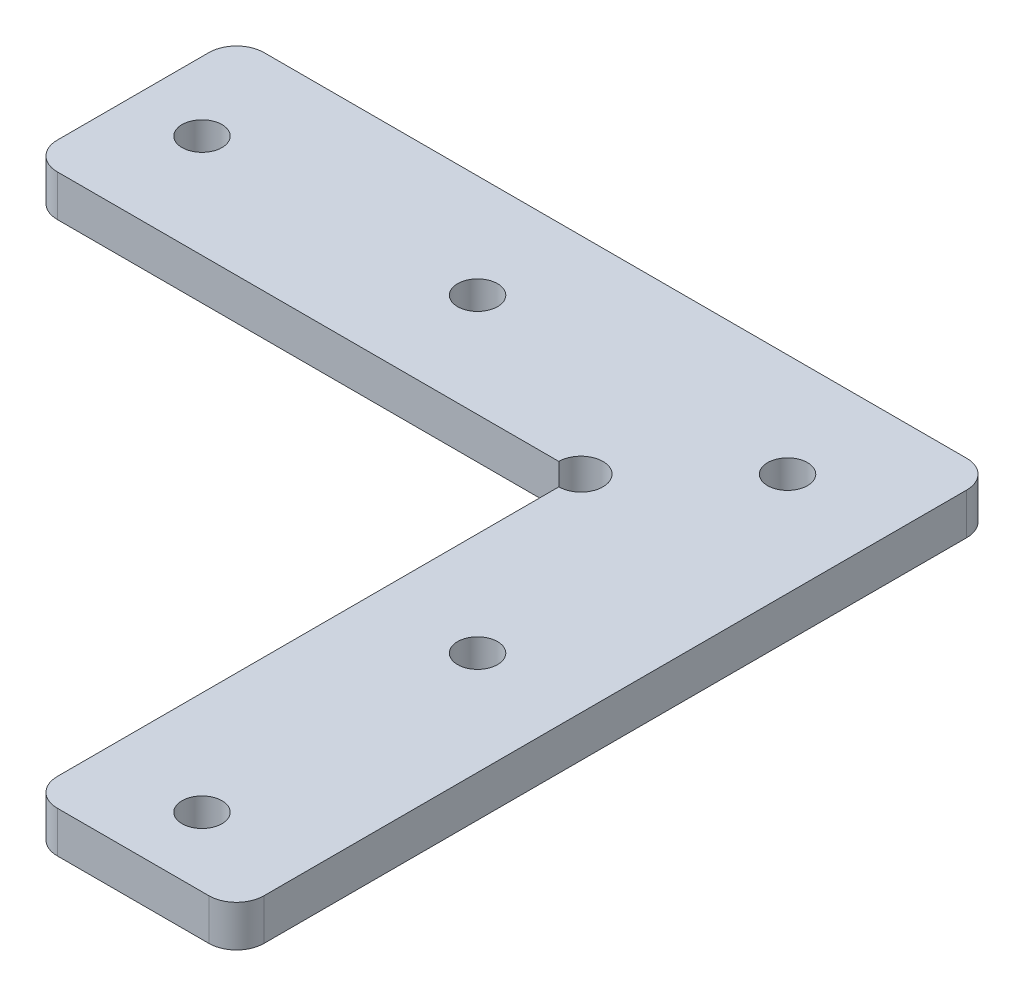
ISO-10303-21;
HEADER;
FILE_DESCRIPTION(('STEP AP214'),'2;1');
FILE_NAME('part.step','',(''),(''),'','','');
FILE_SCHEMA(('AUTOMOTIVE_DESIGN { 1 0 10303 214 1 1 1 1 }'));
ENDSEC;
DATA;
#1=APPLICATION_CONTEXT('core data for automotive mechanical design processes');
#2=APPLICATION_PROTOCOL_DEFINITION('international standard','automotive_design',2000,#1);
#3=PRODUCT_CONTEXT('',#1,'mechanical');
#4=PRODUCT('Part','Part','',(#3));
#5=PRODUCT_RELATED_PRODUCT_CATEGORY('part','',(#4));
#6=PRODUCT_DEFINITION_FORMATION('','',#4);
#7=PRODUCT_DEFINITION_CONTEXT('part definition',#1,'design');
#8=PRODUCT_DEFINITION('design','',#6,#7);
#9=PRODUCT_DEFINITION_SHAPE('','',#8);
#10=(LENGTH_UNIT() NAMED_UNIT(*) SI_UNIT(.MILLI.,.METRE.));
#11=(NAMED_UNIT(*) PLANE_ANGLE_UNIT() SI_UNIT($,.RADIAN.));
#12=(NAMED_UNIT(*) SI_UNIT($,.STERADIAN.) SOLID_ANGLE_UNIT());
#13=UNCERTAINTY_MEASURE_WITH_UNIT(LENGTH_MEASURE(1.E-05),#10,'distance_accuracy_value','');
#14=(GEOMETRIC_REPRESENTATION_CONTEXT(3) GLOBAL_UNCERTAINTY_ASSIGNED_CONTEXT((#13)) GLOBAL_UNIT_ASSIGNED_CONTEXT((#10,
#11,#12)) REPRESENTATION_CONTEXT('',''));
#15=CARTESIAN_POINT('',(0.,0.,0.));
#16=DIRECTION('',(0.,0.,1.));
#17=DIRECTION('',(1.,0.,0.));
#18=AXIS2_PLACEMENT_3D('',#15,#16,#17);
#19=CARTESIAN_POINT('',(0.,3.,0.));
#20=DIRECTION('',(0.,-1.,0.));
#21=DIRECTION('',(0.,0.,-1.));
#22=AXIS2_PLACEMENT_3D('',#19,#20,#21);
#23=PLANE('',#22);
#24=DIRECTION('',(1.,0.,0.));
#25=VECTOR('',#24,1.);
#26=CARTESIAN_POINT('',(-15.,3.,15.));
#27=LINE('',#26,#25);
#28=CARTESIAN_POINT('',(-53.,3.,15.));
#29=VERTEX_POINT('',#28);
#30=CARTESIAN_POINT('',(-16.6,3.,15.));
#31=VERTEX_POINT('',#30);
#32=EDGE_CURVE('E141',#29,#31,#27,.T.);
#33=ORIENTED_EDGE('',*,*,#32,.T.);
#34=CARTESIAN_POINT('',(-15.,3.,15.));
#35=DIRECTION('',(0.,1.,0.));
#36=DIRECTION('',(0.,0.,1.));
#37=AXIS2_PLACEMENT_3D('',#34,#35,#36);
#38=CIRCLE('',#37,1.6);
#39=CARTESIAN_POINT('',(-15.,3.,16.6));
#40=VERTEX_POINT('',#39);
#41=EDGE_CURVE('E130',#40,#31,#38,.T.);
#42=ORIENTED_EDGE('',*,*,#41,.F.);
#43=DIRECTION('',(0.,0.,1.));
#44=VECTOR('',#43,1.);
#45=CARTESIAN_POINT('',(-15.,3.,55.));
#46=LINE('',#45,#44);
#47=CARTESIAN_POINT('',(-15.,3.,53.));
#48=VERTEX_POINT('',#47);
#49=EDGE_CURVE('E138',#40,#48,#46,.T.);
#50=ORIENTED_EDGE('',*,*,#49,.T.);
#51=CARTESIAN_POINT('',(-13.,3.,53.));
#52=DIRECTION('',(0.,-1.,0.));
#53=DIRECTION('',(0.,0.,-1.));
#54=AXIS2_PLACEMENT_3D('',#51,#52,#53);
#55=CIRCLE('',#54,2.);
#56=CARTESIAN_POINT('',(-13.,3.,55.));
#57=VERTEX_POINT('',#56);
#58=EDGE_CURVE('E202',#48,#57,#55,.F.);
#59=ORIENTED_EDGE('',*,*,#58,.T.);
#60=DIRECTION('',(1.,0.,0.));
#61=VECTOR('',#60,1.);
#62=CARTESIAN_POINT('',(0.,3.,55.));
#63=LINE('',#62,#61);
#64=CARTESIAN_POINT('',(-2.,3.,55.));
#65=VERTEX_POINT('',#64);
#66=EDGE_CURVE('E147',#57,#65,#63,.T.);
#67=ORIENTED_EDGE('',*,*,#66,.T.);
#68=CARTESIAN_POINT('',(-2.,3.,53.));
#69=DIRECTION('',(0.,-1.,0.));
#70=DIRECTION('',(0.,0.,-1.));
#71=AXIS2_PLACEMENT_3D('',#68,#69,#70);
#72=CIRCLE('',#71,2.);
#73=CARTESIAN_POINT('',(0.,3.,53.));
#74=VERTEX_POINT('',#73);
#75=EDGE_CURVE('E200',#65,#74,#72,.F.);
#76=ORIENTED_EDGE('',*,*,#75,.T.);
#77=DIRECTION('',(0.,0.,-1.));
#78=VECTOR('',#77,1.);
#79=CARTESIAN_POINT('',(0.,3.,0.));
#80=LINE('',#79,#78);
#81=CARTESIAN_POINT('',(0.,3.,2.));
#82=VERTEX_POINT('',#81);
#83=EDGE_CURVE('E150',#74,#82,#80,.T.);
#84=ORIENTED_EDGE('',*,*,#83,.T.);
#85=CARTESIAN_POINT('',(-2.,3.,2.));
#86=DIRECTION('',(0.,-1.,0.));
#87=DIRECTION('',(0.,0.,-1.));
#88=AXIS2_PLACEMENT_3D('',#85,#86,#87);
#89=CIRCLE('',#88,2.);
#90=CARTESIAN_POINT('',(-2.,3.,0.));
#91=VERTEX_POINT('',#90);
#92=EDGE_CURVE('E198',#82,#91,#89,.F.);
#93=ORIENTED_EDGE('',*,*,#92,.T.);
#94=DIRECTION('',(-1.,0.,0.));
#95=VECTOR('',#94,1.);
#96=CARTESIAN_POINT('',(-55.,3.,0.));
#97=LINE('',#96,#95);
#98=CARTESIAN_POINT('',(-53.,3.,0.));
#99=VERTEX_POINT('',#98);
#100=EDGE_CURVE('E157',#91,#99,#97,.T.);
#101=ORIENTED_EDGE('',*,*,#100,.T.);
#102=CARTESIAN_POINT('',(-53.,3.,2.));
#103=DIRECTION('',(0.,-1.,0.));
#104=DIRECTION('',(0.,0.,-1.));
#105=AXIS2_PLACEMENT_3D('',#102,#103,#104);
#106=CIRCLE('',#105,2.);
#107=CARTESIAN_POINT('',(-55.,3.,2.));
#108=VERTEX_POINT('',#107);
#109=EDGE_CURVE('E206',#99,#108,#106,.F.);
#110=ORIENTED_EDGE('',*,*,#109,.T.);
#111=DIRECTION('',(0.,0.,1.));
#112=VECTOR('',#111,1.);
#113=CARTESIAN_POINT('',(-55.,3.,15.));
#114=LINE('',#113,#112);
#115=CARTESIAN_POINT('',(-55.,3.,13.));
#116=VERTEX_POINT('',#115);
#117=EDGE_CURVE('E152',#108,#116,#114,.T.);
#118=ORIENTED_EDGE('',*,*,#117,.T.);
#119=CARTESIAN_POINT('',(-53.,3.,13.));
#120=DIRECTION('',(0.,-1.,0.));
#121=DIRECTION('',(0.,0.,-1.));
#122=AXIS2_PLACEMENT_3D('',#119,#120,#121);
#123=CIRCLE('',#122,2.);
#124=EDGE_CURVE('E204',#116,#29,#123,.F.);
#125=ORIENTED_EDGE('',*,*,#124,.T.);
#126=EDGE_LOOP('',(#33,#42,#50,#59,#67,#76,#84,#93,#101,#110,#118,#125));
#127=FACE_BOUND('',#126,.T.);
#128=CARTESIAN_POINT('',(-7.5,3.,7.5));
#129=DIRECTION('',(0.,1.,0.));
#130=DIRECTION('',(0.,0.,1.));
#131=AXIS2_PLACEMENT_3D('',#128,#129,#130);
#132=CIRCLE('',#131,1.45);
#133=CARTESIAN_POINT('',(-7.5,3.,8.95));
#134=VERTEX_POINT('',#133);
#135=EDGE_CURVE('E165',#134,#134,#132,.T.);
#136=ORIENTED_EDGE('',*,*,#135,.F.);
#137=EDGE_LOOP('',(#136));
#138=FACE_BOUND('',#137,.T.);
#139=CARTESIAN_POINT('',(-7.49999999999999,3.,30.));
#140=DIRECTION('',(0.,1.,0.));
#141=DIRECTION('',(0.,0.,1.));
#142=AXIS2_PLACEMENT_3D('',#139,#140,#141);
#143=CIRCLE('',#142,1.45);
#144=CARTESIAN_POINT('',(-7.49999999999999,3.,31.45));
#145=VERTEX_POINT('',#144);
#146=EDGE_CURVE('E275',#145,#145,#143,.T.);
#147=ORIENTED_EDGE('',*,*,#146,.F.);
#148=EDGE_LOOP('',(#147));
#149=FACE_BOUND('',#148,.T.);
#150=CARTESIAN_POINT('',(-7.49999999999999,3.,50.));
#151=DIRECTION('',(0.,1.,0.));
#152=DIRECTION('',(0.,0.,1.));
#153=AXIS2_PLACEMENT_3D('',#150,#151,#152);
#154=CIRCLE('',#153,1.45);
#155=CARTESIAN_POINT('',(-7.49999999999999,3.,51.45));
#156=VERTEX_POINT('',#155);
#157=EDGE_CURVE('E269',#156,#156,#154,.T.);
#158=ORIENTED_EDGE('',*,*,#157,.F.);
#159=EDGE_LOOP('',(#158));
#160=FACE_BOUND('',#159,.T.);
#161=CARTESIAN_POINT('',(-30.,3.,7.5));
#162=DIRECTION('',(0.,1.,0.));
#163=DIRECTION('',(0.,0.,1.));
#164=AXIS2_PLACEMENT_3D('',#161,#162,#163);
#165=CIRCLE('',#164,1.45);
#166=CARTESIAN_POINT('',(-30.,3.,8.95));
#167=VERTEX_POINT('',#166);
#168=EDGE_CURVE('E263',#167,#167,#165,.T.);
#169=ORIENTED_EDGE('',*,*,#168,.F.);
#170=EDGE_LOOP('',(#169));
#171=FACE_BOUND('',#170,.T.);
#172=CARTESIAN_POINT('',(-50.,3.,7.5));
#173=DIRECTION('',(0.,1.,0.));
#174=DIRECTION('',(0.,0.,1.));
#175=AXIS2_PLACEMENT_3D('',#172,#173,#174);
#176=CIRCLE('',#175,1.45);
#177=CARTESIAN_POINT('',(-50.,3.,8.95));
#178=VERTEX_POINT('',#177);
#179=EDGE_CURVE('E256',#178,#178,#176,.T.);
#180=ORIENTED_EDGE('',*,*,#179,.F.);
#181=EDGE_LOOP('',(#180));
#182=FACE_BOUND('',#181,.T.);
#183=ADVANCED_FACE('F41',(#127,#138,#149,#160,#171,#182),#23,.F.);
#184=CARTESIAN_POINT('',(0.,0.,0.));
#185=DIRECTION('',(0.,-1.,0.));
#186=DIRECTION('',(0.,0.,-1.));
#187=AXIS2_PLACEMENT_3D('',#184,#185,#186);
#188=PLANE('',#187);
#189=CARTESIAN_POINT('',(-15.,0.,15.));
#190=DIRECTION('',(0.,1.,0.));
#191=DIRECTION('',(0.,0.,1.));
#192=AXIS2_PLACEMENT_3D('',#189,#190,#191);
#193=CIRCLE('',#192,1.6);
#194=CARTESIAN_POINT('',(-15.,0.,16.6));
#195=VERTEX_POINT('',#194);
#196=CARTESIAN_POINT('',(-16.6,0.,15.));
#197=VERTEX_POINT('',#196);
#198=EDGE_CURVE('E56',#195,#197,#193,.T.);
#199=ORIENTED_EDGE('',*,*,#198,.T.);
#200=DIRECTION('',(1.,0.,0.));
#201=VECTOR('',#200,1.);
#202=CARTESIAN_POINT('',(-15.,0.,15.));
#203=LINE('',#202,#201);
#204=CARTESIAN_POINT('',(-53.,0.,15.));
#205=VERTEX_POINT('',#204);
#206=EDGE_CURVE('E164',#205,#197,#203,.T.);
#207=ORIENTED_EDGE('',*,*,#206,.F.);
#208=CARTESIAN_POINT('',(-53.,0.,13.));
#209=DIRECTION('',(0.,-1.,0.));
#210=DIRECTION('',(0.,0.,-1.));
#211=AXIS2_PLACEMENT_3D('',#208,#209,#210);
#212=CIRCLE('',#211,2.);
#213=CARTESIAN_POINT('',(-55.,0.,13.));
#214=VERTEX_POINT('',#213);
#215=EDGE_CURVE('E189',#205,#214,#212,.T.);
#216=ORIENTED_EDGE('',*,*,#215,.T.);
#217=DIRECTION('',(0.,0.,1.));
#218=VECTOR('',#217,1.);
#219=CARTESIAN_POINT('',(-55.,0.,15.));
#220=LINE('',#219,#218);
#221=CARTESIAN_POINT('',(-55.,0.,2.));
#222=VERTEX_POINT('',#221);
#223=EDGE_CURVE('E161',#222,#214,#220,.T.);
#224=ORIENTED_EDGE('',*,*,#223,.F.);
#225=CARTESIAN_POINT('',(-53.,0.,2.));
#226=DIRECTION('',(0.,-1.,0.));
#227=DIRECTION('',(0.,0.,-1.));
#228=AXIS2_PLACEMENT_3D('',#225,#226,#227);
#229=CIRCLE('',#228,2.);
#230=CARTESIAN_POINT('',(-53.,0.,0.));
#231=VERTEX_POINT('',#230);
#232=EDGE_CURVE('E191',#222,#231,#229,.T.);
#233=ORIENTED_EDGE('',*,*,#232,.T.);
#234=DIRECTION('',(-1.,0.,0.));
#235=VECTOR('',#234,1.);
#236=CARTESIAN_POINT('',(-55.,0.,0.));
#237=LINE('',#236,#235);
#238=CARTESIAN_POINT('',(-2.,0.,0.));
#239=VERTEX_POINT('',#238);
#240=EDGE_CURVE('E175',#239,#231,#237,.T.);
#241=ORIENTED_EDGE('',*,*,#240,.F.);
#242=CARTESIAN_POINT('',(-2.,0.,2.));
#243=DIRECTION('',(0.,-1.,0.));
#244=DIRECTION('',(0.,0.,-1.));
#245=AXIS2_PLACEMENT_3D('',#242,#243,#244);
#246=CIRCLE('',#245,2.);
#247=CARTESIAN_POINT('',(0.,0.,2.));
#248=VERTEX_POINT('',#247);
#249=EDGE_CURVE('E182',#239,#248,#246,.T.);
#250=ORIENTED_EDGE('',*,*,#249,.T.);
#251=DIRECTION('',(0.,0.,-1.));
#252=VECTOR('',#251,1.);
#253=CARTESIAN_POINT('',(0.,0.,0.));
#254=LINE('',#253,#252);
#255=CARTESIAN_POINT('',(0.,0.,53.));
#256=VERTEX_POINT('',#255);
#257=EDGE_CURVE('E173',#256,#248,#254,.T.);
#258=ORIENTED_EDGE('',*,*,#257,.F.);
#259=CARTESIAN_POINT('',(-2.,0.,53.));
#260=DIRECTION('',(0.,-1.,0.));
#261=DIRECTION('',(0.,0.,-1.));
#262=AXIS2_PLACEMENT_3D('',#259,#260,#261);
#263=CIRCLE('',#262,2.);
#264=CARTESIAN_POINT('',(-2.,0.,55.));
#265=VERTEX_POINT('',#264);
#266=EDGE_CURVE('E184',#256,#265,#263,.T.);
#267=ORIENTED_EDGE('',*,*,#266,.T.);
#268=DIRECTION('',(1.,0.,0.));
#269=VECTOR('',#268,1.);
#270=CARTESIAN_POINT('',(0.,0.,55.));
#271=LINE('',#270,#269);
#272=CARTESIAN_POINT('',(-13.,0.,55.));
#273=VERTEX_POINT('',#272);
#274=EDGE_CURVE('E170',#273,#265,#271,.T.);
#275=ORIENTED_EDGE('',*,*,#274,.F.);
#276=CARTESIAN_POINT('',(-13.,0.,53.));
#277=DIRECTION('',(0.,-1.,0.));
#278=DIRECTION('',(0.,0.,-1.));
#279=AXIS2_PLACEMENT_3D('',#276,#277,#278);
#280=CIRCLE('',#279,2.);
#281=CARTESIAN_POINT('',(-15.,0.,53.));
#282=VERTEX_POINT('',#281);
#283=EDGE_CURVE('E186',#273,#282,#280,.T.);
#284=ORIENTED_EDGE('',*,*,#283,.T.);
#285=DIRECTION('',(0.,0.,1.));
#286=VECTOR('',#285,1.);
#287=CARTESIAN_POINT('',(-15.,0.,55.));
#288=LINE('',#287,#286);
#289=EDGE_CURVE('E168',#195,#282,#288,.T.);
#290=ORIENTED_EDGE('',*,*,#289,.F.);
#291=EDGE_LOOP('',(#199,#207,#216,#224,#233,#241,#250,#258,#267,#275,#284,#290));
#292=FACE_BOUND('',#291,.T.);
#293=CARTESIAN_POINT('',(-30.,0.,7.5));
#294=DIRECTION('',(0.,1.,0.));
#295=DIRECTION('',(0.,0.,1.));
#296=AXIS2_PLACEMENT_3D('',#293,#294,#295);
#297=CIRCLE('',#296,1.45);
#298=CARTESIAN_POINT('',(-30.,0.,8.95));
#299=VERTEX_POINT('',#298);
#300=EDGE_CURVE('E261',#299,#299,#297,.T.);
#301=ORIENTED_EDGE('',*,*,#300,.T.);
#302=EDGE_LOOP('',(#301));
#303=FACE_BOUND('',#302,.T.);
#304=CARTESIAN_POINT('',(-7.49999999999999,0.,30.));
#305=DIRECTION('',(0.,1.,0.));
#306=DIRECTION('',(0.,0.,1.));
#307=AXIS2_PLACEMENT_3D('',#304,#305,#306);
#308=CIRCLE('',#307,1.45);
#309=CARTESIAN_POINT('',(-7.49999999999999,0.,31.45));
#310=VERTEX_POINT('',#309);
#311=EDGE_CURVE('E272',#310,#310,#308,.T.);
#312=ORIENTED_EDGE('',*,*,#311,.T.);
#313=EDGE_LOOP('',(#312));
#314=FACE_BOUND('',#313,.T.);
#315=CARTESIAN_POINT('',(-7.5,0.,7.5));
#316=DIRECTION('',(0.,1.,0.));
#317=DIRECTION('',(0.,0.,1.));
#318=AXIS2_PLACEMENT_3D('',#315,#316,#317);
#319=CIRCLE('',#318,1.45);
#320=CARTESIAN_POINT('',(-7.5,0.,8.95));
#321=VERTEX_POINT('',#320);
#322=EDGE_CURVE('E278',#321,#321,#319,.T.);
#323=ORIENTED_EDGE('',*,*,#322,.T.);
#324=EDGE_LOOP('',(#323));
#325=FACE_BOUND('',#324,.T.);
#326=CARTESIAN_POINT('',(-7.49999999999999,0.,50.));
#327=DIRECTION('',(0.,1.,0.));
#328=DIRECTION('',(0.,0.,1.));
#329=AXIS2_PLACEMENT_3D('',#326,#327,#328);
#330=CIRCLE('',#329,1.45);
#331=CARTESIAN_POINT('',(-7.49999999999999,0.,51.45));
#332=VERTEX_POINT('',#331);
#333=EDGE_CURVE('E266',#332,#332,#330,.T.);
#334=ORIENTED_EDGE('',*,*,#333,.T.);
#335=EDGE_LOOP('',(#334));
#336=FACE_BOUND('',#335,.T.);
#337=CARTESIAN_POINT('',(-50.,0.,7.5));
#338=DIRECTION('',(0.,1.,0.));
#339=DIRECTION('',(0.,0.,1.));
#340=AXIS2_PLACEMENT_3D('',#337,#338,#339);
#341=CIRCLE('',#340,1.45);
#342=CARTESIAN_POINT('',(-50.,0.,8.95));
#343=VERTEX_POINT('',#342);
#344=EDGE_CURVE('E253',#343,#343,#341,.T.);
#345=ORIENTED_EDGE('',*,*,#344,.T.);
#346=EDGE_LOOP('',(#345));
#347=FACE_BOUND('',#346,.T.);
#348=ADVANCED_FACE('F224',(#292,#303,#314,#325,#336,#347),#188,.T.);
#349=CARTESIAN_POINT('',(-55.,3.,15.));
#350=DIRECTION('',(1.,0.,0.));
#351=DIRECTION('',(0.,0.,-1.));
#352=AXIS2_PLACEMENT_3D('',#349,#350,#351);
#353=PLANE('',#352);
#354=ORIENTED_EDGE('',*,*,#117,.F.);
#355=DIRECTION('',(0.,-1.,0.));
#356=VECTOR('',#355,1.);
#357=CARTESIAN_POINT('',(-55.,3.,2.));
#358=LINE('',#357,#356);
#359=EDGE_CURVE('E179',#108,#222,#358,.T.);
#360=ORIENTED_EDGE('',*,*,#359,.T.);
#361=ORIENTED_EDGE('',*,*,#223,.T.);
#362=DIRECTION('',(0.,-1.,0.));
#363=VECTOR('',#362,1.);
#364=CARTESIAN_POINT('',(-55.,3.,13.));
#365=LINE('',#364,#363);
#366=EDGE_CURVE('E160',#214,#116,#365,.F.);
#367=ORIENTED_EDGE('',*,*,#366,.T.);
#368=EDGE_LOOP('',(#354,#360,#361,#367));
#369=FACE_BOUND('',#368,.T.);
#370=ADVANCED_FACE('F243',(#369),#353,.F.);
#371=CARTESIAN_POINT('',(-15.,3.,15.));
#372=DIRECTION('',(0.,0.,-1.));
#373=DIRECTION('',(-1.,0.,0.));
#374=AXIS2_PLACEMENT_3D('',#371,#372,#373);
#375=PLANE('',#374);
#376=ORIENTED_EDGE('',*,*,#206,.T.);
#377=DIRECTION('',(0.,1.,0.));
#378=VECTOR('',#377,1.);
#379=CARTESIAN_POINT('',(-16.6,0.,15.));
#380=LINE('',#379,#378);
#381=EDGE_CURVE('E252',#197,#31,#380,.T.);
#382=ORIENTED_EDGE('',*,*,#381,.T.);
#383=ORIENTED_EDGE('',*,*,#32,.F.);
#384=DIRECTION('',(0.,-1.,0.));
#385=VECTOR('',#384,1.);
#386=CARTESIAN_POINT('',(-53.,3.,15.));
#387=LINE('',#386,#385);
#388=EDGE_CURVE('E208',#29,#205,#387,.T.);
#389=ORIENTED_EDGE('',*,*,#388,.T.);
#390=EDGE_LOOP('',(#376,#382,#383,#389));
#391=FACE_BOUND('',#390,.T.);
#392=ADVANCED_FACE('F251',(#391),#375,.F.);
#393=CARTESIAN_POINT('',(-15.,3.,55.));
#394=DIRECTION('',(1.,0.,0.));
#395=DIRECTION('',(0.,0.,-1.));
#396=AXIS2_PLACEMENT_3D('',#393,#394,#395);
#397=PLANE('',#396);
#398=ORIENTED_EDGE('',*,*,#49,.F.);
#399=DIRECTION('',(0.,1.,0.));
#400=VECTOR('',#399,1.);
#401=CARTESIAN_POINT('',(-15.,0.,16.6));
#402=LINE('',#401,#400);
#403=EDGE_CURVE('E11',#40,#195,#402,.F.);
#404=ORIENTED_EDGE('',*,*,#403,.T.);
#405=ORIENTED_EDGE('',*,*,#289,.T.);
#406=DIRECTION('',(0.,-1.,0.));
#407=VECTOR('',#406,1.);
#408=CARTESIAN_POINT('',(-15.,3.,53.));
#409=LINE('',#408,#407);
#410=EDGE_CURVE('E145',#282,#48,#409,.F.);
#411=ORIENTED_EDGE('',*,*,#410,.T.);
#412=EDGE_LOOP('',(#398,#404,#405,#411));
#413=FACE_BOUND('',#412,.T.);
#414=ADVANCED_FACE('F143',(#413),#397,.F.);
#415=CARTESIAN_POINT('',(0.,3.,55.));
#416=DIRECTION('',(0.,0.,-1.));
#417=DIRECTION('',(-1.,0.,0.));
#418=AXIS2_PLACEMENT_3D('',#415,#416,#417);
#419=PLANE('',#418);
#420=ORIENTED_EDGE('',*,*,#66,.F.);
#421=DIRECTION('',(0.,-1.,0.));
#422=VECTOR('',#421,1.);
#423=CARTESIAN_POINT('',(-13.,3.,55.));
#424=LINE('',#423,#422);
#425=EDGE_CURVE('E213',#57,#273,#424,.T.);
#426=ORIENTED_EDGE('',*,*,#425,.T.);
#427=ORIENTED_EDGE('',*,*,#274,.T.);
#428=DIRECTION('',(0.,-1.,0.));
#429=VECTOR('',#428,1.);
#430=CARTESIAN_POINT('',(-2.,3.,55.));
#431=LINE('',#430,#429);
#432=EDGE_CURVE('E211',#265,#65,#431,.F.);
#433=ORIENTED_EDGE('',*,*,#432,.T.);
#434=EDGE_LOOP('',(#420,#426,#427,#433));
#435=FACE_BOUND('',#434,.T.);
#436=ADVANCED_FACE('F311',(#435),#419,.F.);
#437=CARTESIAN_POINT('',(0.,3.,0.));
#438=DIRECTION('',(-1.,0.,0.));
#439=DIRECTION('',(0.,0.,1.));
#440=AXIS2_PLACEMENT_3D('',#437,#438,#439);
#441=PLANE('',#440);
#442=ORIENTED_EDGE('',*,*,#83,.F.);
#443=DIRECTION('',(0.,-1.,0.));
#444=VECTOR('',#443,1.);
#445=CARTESIAN_POINT('',(0.,3.,53.));
#446=LINE('',#445,#444);
#447=EDGE_CURVE('E49',#74,#256,#446,.T.);
#448=ORIENTED_EDGE('',*,*,#447,.T.);
#449=ORIENTED_EDGE('',*,*,#257,.T.);
#450=DIRECTION('',(0.,-1.,0.));
#451=VECTOR('',#450,1.);
#452=CARTESIAN_POINT('',(0.,3.,2.));
#453=LINE('',#452,#451);
#454=EDGE_CURVE('E63',#248,#82,#453,.F.);
#455=ORIENTED_EDGE('',*,*,#454,.T.);
#456=EDGE_LOOP('',(#442,#448,#449,#455));
#457=FACE_BOUND('',#456,.T.);
#458=ADVANCED_FACE('F220',(#457),#441,.F.);
#459=CARTESIAN_POINT('',(-55.,3.,0.));
#460=DIRECTION('',(0.,0.,1.));
#461=DIRECTION('',(1.,0.,0.));
#462=AXIS2_PLACEMENT_3D('',#459,#460,#461);
#463=PLANE('',#462);
#464=ORIENTED_EDGE('',*,*,#240,.T.);
#465=DIRECTION('',(0.,-1.,0.));
#466=VECTOR('',#465,1.);
#467=CARTESIAN_POINT('',(-53.,3.,0.));
#468=LINE('',#467,#466);
#469=EDGE_CURVE('E196',#231,#99,#468,.F.);
#470=ORIENTED_EDGE('',*,*,#469,.T.);
#471=ORIENTED_EDGE('',*,*,#100,.F.);
#472=DIRECTION('',(0.,-1.,0.));
#473=VECTOR('',#472,1.);
#474=CARTESIAN_POINT('',(-2.,3.,0.));
#475=LINE('',#474,#473);
#476=EDGE_CURVE('E193',#91,#239,#475,.T.);
#477=ORIENTED_EDGE('',*,*,#476,.T.);
#478=EDGE_LOOP('',(#464,#470,#471,#477));
#479=FACE_BOUND('',#478,.T.);
#480=ADVANCED_FACE('F233',(#479),#463,.F.);
#481=CARTESIAN_POINT('',(-7.5,3.,7.5));
#482=DIRECTION('',(0.,-1.,0.));
#483=DIRECTION('',(0.,0.,-1.));
#484=AXIS2_PLACEMENT_3D('',#481,#482,#483);
#485=CYLINDRICAL_SURFACE('',#484,1.45);
#486=ORIENTED_EDGE('',*,*,#135,.T.);
#487=EDGE_LOOP('',(#486));
#488=FACE_BOUND('',#487,.T.);
#489=ORIENTED_EDGE('',*,*,#322,.F.);
#490=EDGE_LOOP('',(#489));
#491=FACE_BOUND('',#490,.T.);
#492=ADVANCED_FACE('F288',(#488,#491),#485,.F.);
#493=CARTESIAN_POINT('',(-7.49999999999999,3.,30.));
#494=DIRECTION('',(0.,-1.,0.));
#495=DIRECTION('',(0.,0.,-1.));
#496=AXIS2_PLACEMENT_3D('',#493,#494,#495);
#497=CYLINDRICAL_SURFACE('',#496,1.45);
#498=ORIENTED_EDGE('',*,*,#146,.T.);
#499=EDGE_LOOP('',(#498));
#500=FACE_BOUND('',#499,.T.);
#501=ORIENTED_EDGE('',*,*,#311,.F.);
#502=EDGE_LOOP('',(#501));
#503=FACE_BOUND('',#502,.T.);
#504=ADVANCED_FACE('F290',(#500,#503),#497,.F.);
#505=CARTESIAN_POINT('',(-7.49999999999999,3.,50.));
#506=DIRECTION('',(0.,-1.,0.));
#507=DIRECTION('',(0.,0.,-1.));
#508=AXIS2_PLACEMENT_3D('',#505,#506,#507);
#509=CYLINDRICAL_SURFACE('',#508,1.45);
#510=ORIENTED_EDGE('',*,*,#157,.T.);
#511=EDGE_LOOP('',(#510));
#512=FACE_BOUND('',#511,.T.);
#513=ORIENTED_EDGE('',*,*,#333,.F.);
#514=EDGE_LOOP('',(#513));
#515=FACE_BOUND('',#514,.T.);
#516=ADVANCED_FACE('F296',(#512,#515),#509,.F.);
#517=CARTESIAN_POINT('',(-30.,3.,7.5));
#518=DIRECTION('',(0.,-1.,0.));
#519=DIRECTION('',(0.,0.,-1.));
#520=AXIS2_PLACEMENT_3D('',#517,#518,#519);
#521=CYLINDRICAL_SURFACE('',#520,1.45);
#522=ORIENTED_EDGE('',*,*,#168,.T.);
#523=EDGE_LOOP('',(#522));
#524=FACE_BOUND('',#523,.T.);
#525=ORIENTED_EDGE('',*,*,#300,.F.);
#526=EDGE_LOOP('',(#525));
#527=FACE_BOUND('',#526,.T.);
#528=ADVANCED_FACE('F345',(#524,#527),#521,.F.);
#529=CARTESIAN_POINT('',(-50.,3.,7.5));
#530=DIRECTION('',(0.,-1.,0.));
#531=DIRECTION('',(0.,0.,-1.));
#532=AXIS2_PLACEMENT_3D('',#529,#530,#531);
#533=CYLINDRICAL_SURFACE('',#532,1.45);
#534=ORIENTED_EDGE('',*,*,#179,.T.);
#535=EDGE_LOOP('',(#534));
#536=FACE_BOUND('',#535,.T.);
#537=ORIENTED_EDGE('',*,*,#344,.F.);
#538=EDGE_LOOP('',(#537));
#539=FACE_BOUND('',#538,.T.);
#540=ADVANCED_FACE('F323',(#536,#539),#533,.F.);
#541=CARTESIAN_POINT('',(-53.,3.,2.));
#542=DIRECTION('',(0.,-1.,0.));
#543=DIRECTION('',(0.,0.,-1.));
#544=AXIS2_PLACEMENT_3D('',#541,#542,#543);
#545=CYLINDRICAL_SURFACE('',#544,2.);
#546=ORIENTED_EDGE('',*,*,#109,.F.);
#547=ORIENTED_EDGE('',*,*,#469,.F.);
#548=ORIENTED_EDGE('',*,*,#232,.F.);
#549=ORIENTED_EDGE('',*,*,#359,.F.);
#550=EDGE_LOOP('',(#546,#547,#548,#549));
#551=FACE_BOUND('',#550,.T.);
#552=ADVANCED_FACE('F240',(#551),#545,.T.);
#553=CARTESIAN_POINT('',(-53.,3.,13.));
#554=DIRECTION('',(0.,-1.,0.));
#555=DIRECTION('',(0.,0.,-1.));
#556=AXIS2_PLACEMENT_3D('',#553,#554,#555);
#557=CYLINDRICAL_SURFACE('',#556,2.);
#558=ORIENTED_EDGE('',*,*,#124,.F.);
#559=ORIENTED_EDGE('',*,*,#366,.F.);
#560=ORIENTED_EDGE('',*,*,#215,.F.);
#561=ORIENTED_EDGE('',*,*,#388,.F.);
#562=EDGE_LOOP('',(#558,#559,#560,#561));
#563=FACE_BOUND('',#562,.T.);
#564=ADVANCED_FACE('F249',(#563),#557,.T.);
#565=CARTESIAN_POINT('',(-13.,3.,53.));
#566=DIRECTION('',(0.,-1.,0.));
#567=DIRECTION('',(0.,0.,-1.));
#568=AXIS2_PLACEMENT_3D('',#565,#566,#567);
#569=CYLINDRICAL_SURFACE('',#568,2.);
#570=ORIENTED_EDGE('',*,*,#58,.F.);
#571=ORIENTED_EDGE('',*,*,#410,.F.);
#572=ORIENTED_EDGE('',*,*,#283,.F.);
#573=ORIENTED_EDGE('',*,*,#425,.F.);
#574=EDGE_LOOP('',(#570,#571,#572,#573));
#575=FACE_BOUND('',#574,.T.);
#576=ADVANCED_FACE('F326',(#575),#569,.T.);
#577=CARTESIAN_POINT('',(-2.,3.,53.));
#578=DIRECTION('',(0.,-1.,0.));
#579=DIRECTION('',(0.,0.,-1.));
#580=AXIS2_PLACEMENT_3D('',#577,#578,#579);
#581=CYLINDRICAL_SURFACE('',#580,2.);
#582=ORIENTED_EDGE('',*,*,#75,.F.);
#583=ORIENTED_EDGE('',*,*,#432,.F.);
#584=ORIENTED_EDGE('',*,*,#266,.F.);
#585=ORIENTED_EDGE('',*,*,#447,.F.);
#586=EDGE_LOOP('',(#582,#583,#584,#585));
#587=FACE_BOUND('',#586,.T.);
#588=ADVANCED_FACE('F328',(#587),#581,.T.);
#589=CARTESIAN_POINT('',(-2.,3.,2.));
#590=DIRECTION('',(0.,-1.,0.));
#591=DIRECTION('',(0.,0.,-1.));
#592=AXIS2_PLACEMENT_3D('',#589,#590,#591);
#593=CYLINDRICAL_SURFACE('',#592,2.);
#594=ORIENTED_EDGE('',*,*,#92,.F.);
#595=ORIENTED_EDGE('',*,*,#454,.F.);
#596=ORIENTED_EDGE('',*,*,#249,.F.);
#597=ORIENTED_EDGE('',*,*,#476,.F.);
#598=EDGE_LOOP('',(#594,#595,#596,#597));
#599=FACE_BOUND('',#598,.T.);
#600=ADVANCED_FACE('F43',(#599),#593,.T.);
#601=CARTESIAN_POINT('',(-15.,0.,15.));
#602=DIRECTION('',(0.,1.,0.));
#603=DIRECTION('',(0.,0.,1.));
#604=AXIS2_PLACEMENT_3D('',#601,#602,#603);
#605=CYLINDRICAL_SURFACE('',#604,1.6);
#606=ORIENTED_EDGE('',*,*,#198,.F.);
#607=ORIENTED_EDGE('',*,*,#403,.F.);
#608=ORIENTED_EDGE('',*,*,#41,.T.);
#609=ORIENTED_EDGE('',*,*,#381,.F.);
#610=EDGE_LOOP('',(#606,#607,#608,#609));
#611=FACE_BOUND('',#610,.T.);
#612=ADVANCED_FACE('F129',(#611),#605,.F.);
#613=CLOSED_SHELL('',(#183,#348,#370,#392,#414,#436,#458,#480,#492,#504,#516,#528,#540,#552,
#564,#576,#588,#600,#612));
#614=MANIFOLD_SOLID_BREP('B2',#613);
#615=ADVANCED_BREP_SHAPE_REPRESENTATION('',(#18,#614),#14);
#616=SHAPE_DEFINITION_REPRESENTATION(#9,#615);
ENDSEC;
END-ISO-10303-21;
